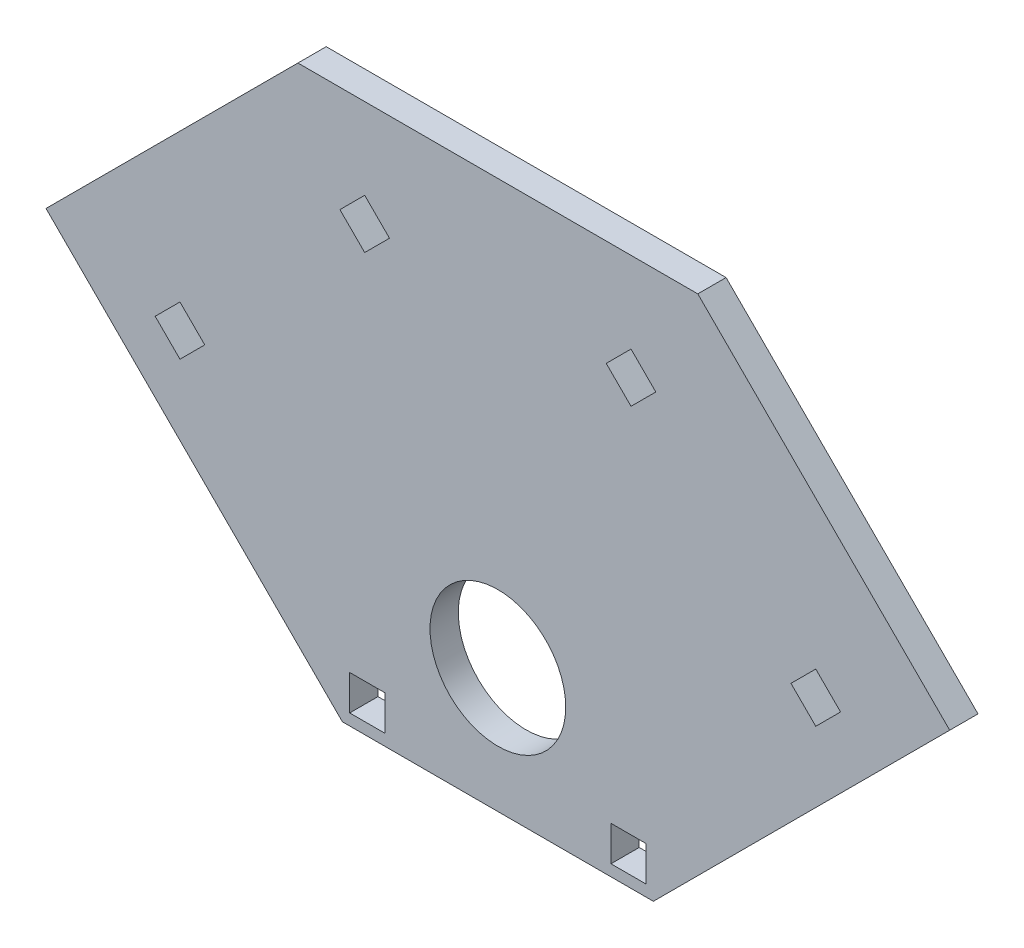
ISO-10303-21;
HEADER;
FILE_DESCRIPTION(('STEP AP214'),'2;1');
FILE_NAME('part.step','',(''),(''),'','','');
FILE_SCHEMA(('AUTOMOTIVE_DESIGN { 1 0 10303 214 1 1 1 1 }'));
ENDSEC;
DATA;
#1=APPLICATION_CONTEXT('core data for automotive mechanical design processes');
#2=APPLICATION_PROTOCOL_DEFINITION('international standard','automotive_design',2000,#1);
#3=PRODUCT_CONTEXT('',#1,'mechanical');
#4=PRODUCT('Part','Part','',(#3));
#5=PRODUCT_RELATED_PRODUCT_CATEGORY('part','',(#4));
#6=PRODUCT_DEFINITION_FORMATION('','',#4);
#7=PRODUCT_DEFINITION_CONTEXT('part definition',#1,'design');
#8=PRODUCT_DEFINITION('design','',#6,#7);
#9=PRODUCT_DEFINITION_SHAPE('','',#8);
#10=(LENGTH_UNIT() NAMED_UNIT(*) SI_UNIT(.MILLI.,.METRE.));
#11=(NAMED_UNIT(*) PLANE_ANGLE_UNIT() SI_UNIT($,.RADIAN.));
#12=(NAMED_UNIT(*) SI_UNIT($,.STERADIAN.) SOLID_ANGLE_UNIT());
#13=UNCERTAINTY_MEASURE_WITH_UNIT(LENGTH_MEASURE(1.E-05),#10,'distance_accuracy_value','');
#14=(GEOMETRIC_REPRESENTATION_CONTEXT(3) GLOBAL_UNCERTAINTY_ASSIGNED_CONTEXT((#13)) GLOBAL_UNIT_ASSIGNED_CONTEXT((#10,
#11,#12)) REPRESENTATION_CONTEXT('',''));
#15=CARTESIAN_POINT('',(0.,0.,0.));
#16=DIRECTION('',(0.,0.,1.));
#17=DIRECTION('',(1.,0.,0.));
#18=AXIS2_PLACEMENT_3D('',#15,#16,#17);
#19=CARTESIAN_POINT('',(0.,0.,5.));
#20=DIRECTION('',(0.,0.,-1.));
#21=DIRECTION('',(-1.,0.,0.));
#22=AXIS2_PLACEMENT_3D('',#19,#20,#21);
#23=PLANE('',#22);
#24=DIRECTION('',(-0.707106781186548,-0.707106781186547,0.));
#25=VECTOR('',#24,1.);
#26=CARTESIAN_POINT('',(56.2149891043305,27.9307178568685,5.));
#27=LINE('',#26,#25);
#28=CARTESIAN_POINT('',(56.2149891043305,27.9307178568685,5.));
#29=VERTEX_POINT('',#28);
#30=CARTESIAN_POINT('',(51.830927060974,23.546655813512,5.));
#31=VERTEX_POINT('',#30);
#32=EDGE_CURVE('E274',#29,#31,#27,.T.);
#33=ORIENTED_EDGE('',*,*,#32,.F.);
#34=DIRECTION('',(-0.707106781186546,0.707106781186549,0.));
#35=VECTOR('',#34,1.);
#36=CARTESIAN_POINT('',(60.599051147687,23.546655813512,5.));
#37=LINE('',#36,#35);
#38=CARTESIAN_POINT('',(60.5990511476871,23.546655813512,5.));
#39=VERTEX_POINT('',#38);
#40=EDGE_CURVE('E282',#39,#29,#37,.T.);
#41=ORIENTED_EDGE('',*,*,#40,.F.);
#42=DIRECTION('',(0.707106781186536,0.707106781186559,0.));
#43=VECTOR('',#42,1.);
#44=CARTESIAN_POINT('',(56.2149891043306,19.1625937701554,5.));
#45=LINE('',#44,#43);
#46=CARTESIAN_POINT('',(56.2149891043306,19.1625937701554,5.));
#47=VERTEX_POINT('',#46);
#48=EDGE_CURVE('E279',#47,#39,#45,.T.);
#49=ORIENTED_EDGE('',*,*,#48,.F.);
#50=DIRECTION('',(0.707106781186548,-0.707106781186547,0.));
#51=VECTOR('',#50,1.);
#52=CARTESIAN_POINT('',(51.830927060974,23.546655813512,5.));
#53=LINE('',#52,#51);
#54=EDGE_CURVE('E276',#31,#47,#53,.T.);
#55=ORIENTED_EDGE('',*,*,#54,.F.);
#56=EDGE_LOOP('',(#33,#41,#49,#55));
#57=FACE_BOUND('',#56,.T.);
#58=DIRECTION('',(0.,1.,0.));
#59=VECTOR('',#58,1.);
#60=CARTESIAN_POINT('',(-20.,-20.,5.));
#61=LINE('',#60,#59);
#62=CARTESIAN_POINT('',(-20.,-20.,5.));
#63=VERTEX_POINT('',#62);
#64=CARTESIAN_POINT('',(-20.,-13.8,5.));
#65=VERTEX_POINT('',#64);
#66=EDGE_CURVE('E336',#63,#65,#61,.T.);
#67=ORIENTED_EDGE('',*,*,#66,.F.);
#68=DIRECTION('',(1.,0.,0.));
#69=VECTOR('',#68,1.);
#70=CARTESIAN_POINT('',(-26.2,-20.,5.));
#71=LINE('',#70,#69);
#72=CARTESIAN_POINT('',(-26.2,-20.,5.));
#73=VERTEX_POINT('',#72);
#74=EDGE_CURVE('E344',#73,#63,#71,.T.);
#75=ORIENTED_EDGE('',*,*,#74,.F.);
#76=DIRECTION('',(0.,-1.,0.));
#77=VECTOR('',#76,1.);
#78=CARTESIAN_POINT('',(-26.2,-20.,5.));
#79=LINE('',#78,#77);
#80=CARTESIAN_POINT('',(-26.2,-13.8,5.));
#81=VERTEX_POINT('',#80);
#82=EDGE_CURVE('E341',#81,#73,#79,.T.);
#83=ORIENTED_EDGE('',*,*,#82,.F.);
#84=DIRECTION('',(-1.,0.,0.));
#85=VECTOR('',#84,1.);
#86=CARTESIAN_POINT('',(-26.2,-13.8,5.));
#87=LINE('',#86,#85);
#88=EDGE_CURVE('E338',#65,#81,#87,.T.);
#89=ORIENTED_EDGE('',*,*,#88,.F.);
#90=EDGE_LOOP('',(#67,#75,#83,#89));
#91=FACE_BOUND('',#90,.T.);
#92=DIRECTION('',(0.707106781186536,-0.707106781186559,0.));
#93=VECTOR('',#92,1.);
#94=CARTESIAN_POINT('',(-56.2149891043306,19.1625937701554,5.));
#95=LINE('',#94,#93);
#96=CARTESIAN_POINT('',(-60.599051147687,23.546655813512,5.));
#97=VERTEX_POINT('',#96);
#98=CARTESIAN_POINT('',(-56.2149891043306,19.1625937701554,5.));
#99=VERTEX_POINT('',#98);
#100=EDGE_CURVE('E398',#97,#99,#95,.T.);
#101=ORIENTED_EDGE('',*,*,#100,.F.);
#102=DIRECTION('',(-0.707106781186546,-0.707106781186549,0.));
#103=VECTOR('',#102,1.);
#104=CARTESIAN_POINT('',(-60.599051147687,23.546655813512,5.));
#105=LINE('',#104,#103);
#106=CARTESIAN_POINT('',(-56.2149891043305,27.9307178568685,5.));
#107=VERTEX_POINT('',#106);
#108=EDGE_CURVE('E406',#107,#97,#105,.T.);
#109=ORIENTED_EDGE('',*,*,#108,.F.);
#110=DIRECTION('',(-0.707106781186548,0.707106781186547,0.));
#111=VECTOR('',#110,1.);
#112=CARTESIAN_POINT('',(-56.2149891043305,27.9307178568685,5.));
#113=LINE('',#112,#111);
#114=CARTESIAN_POINT('',(-51.830927060974,23.546655813512,5.));
#115=VERTEX_POINT('',#114);
#116=EDGE_CURVE('E403',#115,#107,#113,.T.);
#117=ORIENTED_EDGE('',*,*,#116,.F.);
#118=DIRECTION('',(0.707106781186548,0.707106781186547,0.));
#119=VECTOR('',#118,1.);
#120=CARTESIAN_POINT('',(-51.830927060974,23.546655813512,5.));
#121=LINE('',#120,#119);
#122=EDGE_CURVE('E400',#99,#115,#121,.T.);
#123=ORIENTED_EDGE('',*,*,#122,.F.);
#124=EDGE_LOOP('',(#101,#109,#117,#123));
#125=FACE_BOUND('',#124,.T.);
#126=DIRECTION('',(-0.707106781186545,-0.70710678118655,0.));
#127=VECTOR('',#126,1.);
#128=CARTESIAN_POINT('',(-41.0121933088199,69.2964645562816,5.));
#129=LINE('',#128,#127);
#130=CARTESIAN_POINT('',(-35.3553390593275,74.953318805774,5.));
#131=VERTEX_POINT('',#130);
#132=CARTESIAN_POINT('',(-79.9030662740799,30.4055915910214,5.));
#133=VERTEX_POINT('',#132);
#134=EDGE_CURVE('E435',#131,#133,#129,.T.);
#135=ORIENTED_EDGE('',*,*,#134,.T.);
#136=DIRECTION('',(0.707106781186549,-0.707106781186546,0.));
#137=VECTOR('',#136,1.);
#138=CARTESIAN_POINT('',(-27.4974746830583,-22.,5.));
#139=LINE('',#138,#137);
#140=CARTESIAN_POINT('',(-27.4974746830583,-22.,5.));
#141=VERTEX_POINT('',#140);
#142=EDGE_CURVE('E437',#133,#141,#139,.T.);
#143=ORIENTED_EDGE('',*,*,#142,.T.);
#144=DIRECTION('',(1.,0.,0.));
#145=VECTOR('',#144,1.);
#146=CARTESIAN_POINT('',(-27.4974746830583,-22.,5.));
#147=LINE('',#146,#145);
#148=CARTESIAN_POINT('',(27.4974746830583,-22.,5.));
#149=VERTEX_POINT('',#148);
#150=EDGE_CURVE('E440',#141,#149,#147,.T.);
#151=ORIENTED_EDGE('',*,*,#150,.T.);
#152=DIRECTION('',(0.707106781186549,0.707106781186546,0.));
#153=VECTOR('',#152,1.);
#154=CARTESIAN_POINT('',(27.4974746830583,-22.,5.));
#155=LINE('',#154,#153);
#156=CARTESIAN_POINT('',(79.9030662740799,30.4055915910214,5.));
#157=VERTEX_POINT('',#156);
#158=EDGE_CURVE('E442',#149,#157,#155,.T.);
#159=ORIENTED_EDGE('',*,*,#158,.T.);
#160=DIRECTION('',(-0.707106781186547,0.707106781186548,0.));
#161=VECTOR('',#160,1.);
#162=CARTESIAN_POINT('',(79.9030662740799,30.4055915910214,5.));
#163=LINE('',#162,#161);
#164=CARTESIAN_POINT('',(35.3553390593276,74.9533188057739,5.));
#165=VERTEX_POINT('',#164);
#166=EDGE_CURVE('E444',#157,#165,#163,.T.);
#167=ORIENTED_EDGE('',*,*,#166,.T.);
#168=DIRECTION('',(-1.,0.,0.));
#169=VECTOR('',#168,1.);
#170=CARTESIAN_POINT('',(-35.3553390593275,74.953318805774,5.));
#171=LINE('',#170,#169);
#172=EDGE_CURVE('E446',#165,#131,#171,.T.);
#173=ORIENTED_EDGE('',*,*,#172,.T.);
#174=EDGE_LOOP('',(#135,#143,#151,#159,#167,#173));
#175=FACE_BOUND('',#174,.T.);
#176=CARTESIAN_POINT('',(0.,0.,5.));
#177=DIRECTION('',(0.,0.,1.));
#178=DIRECTION('',(1.,0.,0.));
#179=AXIS2_PLACEMENT_3D('',#176,#177,#178);
#180=CIRCLE('',#179,12.);
#181=CARTESIAN_POINT('',(12.,0.,5.));
#182=VERTEX_POINT('',#181);
#183=EDGE_CURVE('E429',#182,#182,#180,.T.);
#184=ORIENTED_EDGE('',*,*,#183,.F.);
#185=EDGE_LOOP('',(#184));
#186=FACE_BOUND('',#185,.T.);
#187=DIRECTION('',(0.707106781186548,-0.707106781186547,0.));
#188=VECTOR('',#187,1.);
#189=CARTESIAN_POINT('',(-23.5466558135121,51.8309270609738,5.));
#190=LINE('',#189,#188);
#191=CARTESIAN_POINT('',(-27.9307178568687,56.2149891043304,5.));
#192=VERTEX_POINT('',#191);
#193=CARTESIAN_POINT('',(-23.5466558135121,51.8309270609738,5.));
#194=VERTEX_POINT('',#193);
#195=EDGE_CURVE('E367',#192,#194,#190,.T.);
#196=ORIENTED_EDGE('',*,*,#195,.F.);
#197=DIRECTION('',(-0.707106781186545,-0.70710678118655,0.));
#198=VECTOR('',#197,1.);
#199=CARTESIAN_POINT('',(-27.9307178568687,56.2149891043304,5.));
#200=LINE('',#199,#198);
#201=CARTESIAN_POINT('',(-23.5466558135121,60.599051147687,5.));
#202=VERTEX_POINT('',#201);
#203=EDGE_CURVE('E375',#202,#192,#200,.T.);
#204=ORIENTED_EDGE('',*,*,#203,.F.);
#205=DIRECTION('',(-0.707106781186549,0.707106781186546,0.));
#206=VECTOR('',#205,1.);
#207=CARTESIAN_POINT('',(-23.5466558135121,60.599051147687,5.));
#208=LINE('',#207,#206);
#209=CARTESIAN_POINT('',(-19.1625937701555,56.2149891043304,5.));
#210=VERTEX_POINT('',#209);
#211=EDGE_CURVE('E372',#210,#202,#208,.T.);
#212=ORIENTED_EDGE('',*,*,#211,.F.);
#213=DIRECTION('',(0.707106781186546,0.707106781186549,0.));
#214=VECTOR('',#213,1.);
#215=CARTESIAN_POINT('',(-19.1625937701555,56.2149891043304,5.));
#216=LINE('',#215,#214);
#217=EDGE_CURVE('E369',#194,#210,#216,.T.);
#218=ORIENTED_EDGE('',*,*,#217,.F.);
#219=EDGE_LOOP('',(#196,#204,#212,#218));
#220=FACE_BOUND('',#219,.T.);
#221=DIRECTION('',(-0.707106781186549,-0.707106781186546,0.));
#222=VECTOR('',#221,1.);
#223=CARTESIAN_POINT('',(23.5466558135121,60.599051147687,5.));
#224=LINE('',#223,#222);
#225=CARTESIAN_POINT('',(23.5466558135121,60.599051147687,5.));
#226=VERTEX_POINT('',#225);
#227=CARTESIAN_POINT('',(19.1625937701555,56.2149891043304,5.));
#228=VERTEX_POINT('',#227);
#229=EDGE_CURVE('E305',#226,#228,#224,.T.);
#230=ORIENTED_EDGE('',*,*,#229,.F.);
#231=DIRECTION('',(-0.707106781186545,0.70710678118655,0.));
#232=VECTOR('',#231,1.);
#233=CARTESIAN_POINT('',(27.9307178568687,56.2149891043304,5.));
#234=LINE('',#233,#232);
#235=CARTESIAN_POINT('',(27.9307178568687,56.2149891043304,5.));
#236=VERTEX_POINT('',#235);
#237=EDGE_CURVE('E313',#236,#226,#234,.T.);
#238=ORIENTED_EDGE('',*,*,#237,.F.);
#239=DIRECTION('',(0.707106781186549,0.707106781186546,0.));
#240=VECTOR('',#239,1.);
#241=CARTESIAN_POINT('',(23.5466558135121,51.8309270609738,5.));
#242=LINE('',#241,#240);
#243=CARTESIAN_POINT('',(23.5466558135121,51.8309270609738,5.));
#244=VERTEX_POINT('',#243);
#245=EDGE_CURVE('E310',#244,#236,#242,.T.);
#246=ORIENTED_EDGE('',*,*,#245,.F.);
#247=DIRECTION('',(0.707106781186546,-0.707106781186549,0.));
#248=VECTOR('',#247,1.);
#249=CARTESIAN_POINT('',(19.1625937701555,56.2149891043304,5.));
#250=LINE('',#249,#248);
#251=EDGE_CURVE('E307',#228,#244,#250,.T.);
#252=ORIENTED_EDGE('',*,*,#251,.F.);
#253=EDGE_LOOP('',(#230,#238,#246,#252));
#254=FACE_BOUND('',#253,.T.);
#255=DIRECTION('',(0.,1.,0.));
#256=VECTOR('',#255,1.);
#257=CARTESIAN_POINT('',(26.2,-20.,5.));
#258=LINE('',#257,#256);
#259=CARTESIAN_POINT('',(26.2,-20.,5.));
#260=VERTEX_POINT('',#259);
#261=CARTESIAN_POINT('',(26.2,-13.8,5.));
#262=VERTEX_POINT('',#261);
#263=EDGE_CURVE('E238',#260,#262,#258,.T.);
#264=ORIENTED_EDGE('',*,*,#263,.F.);
#265=DIRECTION('',(1.,0.,0.));
#266=VECTOR('',#265,1.);
#267=CARTESIAN_POINT('',(26.2,-20.,5.));
#268=LINE('',#267,#266);
#269=CARTESIAN_POINT('',(20.,-20.,5.));
#270=VERTEX_POINT('',#269);
#271=EDGE_CURVE('E260',#270,#260,#268,.T.);
#272=ORIENTED_EDGE('',*,*,#271,.F.);
#273=DIRECTION('',(0.,-1.,0.));
#274=VECTOR('',#273,1.);
#275=CARTESIAN_POINT('',(20.,-20.,5.));
#276=LINE('',#275,#274);
#277=CARTESIAN_POINT('',(20.,-13.8,5.));
#278=VERTEX_POINT('',#277);
#279=EDGE_CURVE('E258',#278,#270,#276,.T.);
#280=ORIENTED_EDGE('',*,*,#279,.F.);
#281=DIRECTION('',(-1.,0.,0.));
#282=VECTOR('',#281,1.);
#283=CARTESIAN_POINT('',(26.2,-13.8,5.));
#284=LINE('',#283,#282);
#285=EDGE_CURVE('E246',#262,#278,#284,.T.);
#286=ORIENTED_EDGE('',*,*,#285,.F.);
#287=EDGE_LOOP('',(#264,#272,#280,#286));
#288=FACE_BOUND('',#287,.T.);
#289=ADVANCED_FACE('F41',(#57,#91,#125,#175,#186,#220,#254,#288),#23,.F.);
#290=CARTESIAN_POINT('',(0.,0.,0.));
#291=DIRECTION('',(0.,0.,-1.));
#292=DIRECTION('',(-1.,0.,0.));
#293=AXIS2_PLACEMENT_3D('',#290,#291,#292);
#294=PLANE('',#293);
#295=DIRECTION('',(-0.707106781186548,-0.707106781186547,0.));
#296=VECTOR('',#295,1.);
#297=CARTESIAN_POINT('',(-79.9030662740799,30.4055915910214,0.));
#298=LINE('',#297,#296);
#299=CARTESIAN_POINT('',(-35.3553390593275,74.953318805774,0.));
#300=VERTEX_POINT('',#299);
#301=CARTESIAN_POINT('',(-79.9030662740799,30.4055915910214,0.));
#302=VERTEX_POINT('',#301);
#303=EDGE_CURVE('E432',#300,#302,#298,.T.);
#304=ORIENTED_EDGE('',*,*,#303,.F.);
#305=DIRECTION('',(-1.,0.,0.));
#306=VECTOR('',#305,1.);
#307=CARTESIAN_POINT('',(-35.3553390593275,74.953318805774,0.));
#308=LINE('',#307,#306);
#309=CARTESIAN_POINT('',(35.3553390593276,74.9533188057739,0.));
#310=VERTEX_POINT('',#309);
#311=EDGE_CURVE('E438',#310,#300,#308,.T.);
#312=ORIENTED_EDGE('',*,*,#311,.F.);
#313=DIRECTION('',(-0.707106781186546,0.707106781186549,0.));
#314=VECTOR('',#313,1.);
#315=CARTESIAN_POINT('',(35.3553390593276,74.9533188057739,0.));
#316=LINE('',#315,#314);
#317=CARTESIAN_POINT('',(79.9030662740799,30.4055915910214,0.));
#318=VERTEX_POINT('',#317);
#319=EDGE_CURVE('E457',#318,#310,#316,.T.);
#320=ORIENTED_EDGE('',*,*,#319,.F.);
#321=DIRECTION('',(0.707106781186549,0.707106781186546,0.));
#322=VECTOR('',#321,1.);
#323=CARTESIAN_POINT('',(27.4974746830583,-22.,0.));
#324=LINE('',#323,#322);
#325=CARTESIAN_POINT('',(27.4974746830583,-22.,0.));
#326=VERTEX_POINT('',#325);
#327=EDGE_CURVE('E454',#326,#318,#324,.T.);
#328=ORIENTED_EDGE('',*,*,#327,.F.);
#329=DIRECTION('',(1.,0.,0.));
#330=VECTOR('',#329,1.);
#331=CARTESIAN_POINT('',(-27.4974746830583,-22.,0.));
#332=LINE('',#331,#330);
#333=CARTESIAN_POINT('',(-27.4974746830583,-22.,0.));
#334=VERTEX_POINT('',#333);
#335=EDGE_CURVE('E452',#334,#326,#332,.T.);
#336=ORIENTED_EDGE('',*,*,#335,.F.);
#337=DIRECTION('',(0.707106781186549,-0.707106781186546,0.));
#338=VECTOR('',#337,1.);
#339=CARTESIAN_POINT('',(-27.4974746830583,-22.,0.));
#340=LINE('',#339,#338);
#341=EDGE_CURVE('E450',#302,#334,#340,.T.);
#342=ORIENTED_EDGE('',*,*,#341,.F.);
#343=EDGE_LOOP('',(#304,#312,#320,#328,#336,#342));
#344=FACE_BOUND('',#343,.T.);
#345=CARTESIAN_POINT('',(0.,0.,0.));
#346=DIRECTION('',(0.,0.,1.));
#347=DIRECTION('',(1.,0.,0.));
#348=AXIS2_PLACEMENT_3D('',#345,#346,#347);
#349=CIRCLE('',#348,12.);
#350=CARTESIAN_POINT('',(12.,0.,0.));
#351=VERTEX_POINT('',#350);
#352=EDGE_CURVE('E428',#351,#351,#349,.T.);
#353=ORIENTED_EDGE('',*,*,#352,.T.);
#354=EDGE_LOOP('',(#353));
#355=FACE_BOUND('',#354,.T.);
#356=DIRECTION('',(-0.707106781186546,-0.707106781186549,0.));
#357=VECTOR('',#356,1.);
#358=CARTESIAN_POINT('',(-60.599051147687,23.546655813512,0.));
#359=LINE('',#358,#357);
#360=CARTESIAN_POINT('',(-56.2149891043305,27.9307178568685,0.));
#361=VERTEX_POINT('',#360);
#362=CARTESIAN_POINT('',(-60.5990511476871,23.546655813512,0.));
#363=VERTEX_POINT('',#362);
#364=EDGE_CURVE('E401',#361,#363,#359,.T.);
#365=ORIENTED_EDGE('',*,*,#364,.T.);
#366=DIRECTION('',(0.707106781186536,-0.707106781186559,0.));
#367=VECTOR('',#366,1.);
#368=CARTESIAN_POINT('',(-56.2149891043306,19.1625937701554,0.));
#369=LINE('',#368,#367);
#370=CARTESIAN_POINT('',(-56.2149891043306,19.1625937701554,0.));
#371=VERTEX_POINT('',#370);
#372=EDGE_CURVE('E397',#363,#371,#369,.T.);
#373=ORIENTED_EDGE('',*,*,#372,.T.);
#374=DIRECTION('',(0.707106781186548,0.707106781186547,0.));
#375=VECTOR('',#374,1.);
#376=CARTESIAN_POINT('',(-51.830927060974,23.546655813512,0.));
#377=LINE('',#376,#375);
#378=CARTESIAN_POINT('',(-51.830927060974,23.546655813512,0.));
#379=VERTEX_POINT('',#378);
#380=EDGE_CURVE('E411',#371,#379,#377,.T.);
#381=ORIENTED_EDGE('',*,*,#380,.T.);
#382=DIRECTION('',(-0.707106781186548,0.707106781186547,0.));
#383=VECTOR('',#382,1.);
#384=CARTESIAN_POINT('',(-56.2149891043305,27.9307178568685,0.));
#385=LINE('',#384,#383);
#386=EDGE_CURVE('E414',#379,#361,#385,.T.);
#387=ORIENTED_EDGE('',*,*,#386,.T.);
#388=EDGE_LOOP('',(#365,#373,#381,#387));
#389=FACE_BOUND('',#388,.T.);
#390=DIRECTION('',(-0.707106781186545,-0.70710678118655,0.));
#391=VECTOR('',#390,1.);
#392=CARTESIAN_POINT('',(-27.9307178568687,56.2149891043304,0.));
#393=LINE('',#392,#391);
#394=CARTESIAN_POINT('',(-23.5466558135121,60.599051147687,0.));
#395=VERTEX_POINT('',#394);
#396=CARTESIAN_POINT('',(-27.9307178568687,56.2149891043304,0.));
#397=VERTEX_POINT('',#396);
#398=EDGE_CURVE('E370',#395,#397,#393,.T.);
#399=ORIENTED_EDGE('',*,*,#398,.T.);
#400=DIRECTION('',(0.707106781186548,-0.707106781186547,0.));
#401=VECTOR('',#400,1.);
#402=CARTESIAN_POINT('',(-23.5466558135121,51.8309270609738,0.));
#403=LINE('',#402,#401);
#404=CARTESIAN_POINT('',(-23.5466558135121,51.8309270609738,0.));
#405=VERTEX_POINT('',#404);
#406=EDGE_CURVE('E366',#397,#405,#403,.T.);
#407=ORIENTED_EDGE('',*,*,#406,.T.);
#408=DIRECTION('',(0.707106781186546,0.707106781186549,0.));
#409=VECTOR('',#408,1.);
#410=CARTESIAN_POINT('',(-19.1625937701555,56.2149891043304,0.));
#411=LINE('',#410,#409);
#412=CARTESIAN_POINT('',(-19.1625937701555,56.2149891043304,0.));
#413=VERTEX_POINT('',#412);
#414=EDGE_CURVE('E380',#405,#413,#411,.T.);
#415=ORIENTED_EDGE('',*,*,#414,.T.);
#416=DIRECTION('',(-0.707106781186549,0.707106781186546,0.));
#417=VECTOR('',#416,1.);
#418=CARTESIAN_POINT('',(-23.5466558135121,60.599051147687,0.));
#419=LINE('',#418,#417);
#420=EDGE_CURVE('E383',#413,#395,#419,.T.);
#421=ORIENTED_EDGE('',*,*,#420,.T.);
#422=EDGE_LOOP('',(#399,#407,#415,#421));
#423=FACE_BOUND('',#422,.T.);
#424=DIRECTION('',(1.,0.,0.));
#425=VECTOR('',#424,1.);
#426=CARTESIAN_POINT('',(-26.2,-20.,0.));
#427=LINE('',#426,#425);
#428=CARTESIAN_POINT('',(-26.2,-20.,0.));
#429=VERTEX_POINT('',#428);
#430=CARTESIAN_POINT('',(-20.,-20.,0.));
#431=VERTEX_POINT('',#430);
#432=EDGE_CURVE('E339',#429,#431,#427,.T.);
#433=ORIENTED_EDGE('',*,*,#432,.T.);
#434=DIRECTION('',(0.,1.,0.));
#435=VECTOR('',#434,1.);
#436=CARTESIAN_POINT('',(-20.,-20.,0.));
#437=LINE('',#436,#435);
#438=CARTESIAN_POINT('',(-20.,-13.8,0.));
#439=VERTEX_POINT('',#438);
#440=EDGE_CURVE('E335',#431,#439,#437,.T.);
#441=ORIENTED_EDGE('',*,*,#440,.T.);
#442=DIRECTION('',(-1.,0.,0.));
#443=VECTOR('',#442,1.);
#444=CARTESIAN_POINT('',(-26.2,-13.8,0.));
#445=LINE('',#444,#443);
#446=CARTESIAN_POINT('',(-26.2,-13.8,0.));
#447=VERTEX_POINT('',#446);
#448=EDGE_CURVE('E349',#439,#447,#445,.T.);
#449=ORIENTED_EDGE('',*,*,#448,.T.);
#450=DIRECTION('',(0.,-1.,0.));
#451=VECTOR('',#450,1.);
#452=CARTESIAN_POINT('',(-26.2,-20.,0.));
#453=LINE('',#452,#451);
#454=EDGE_CURVE('E352',#447,#429,#453,.T.);
#455=ORIENTED_EDGE('',*,*,#454,.T.);
#456=EDGE_LOOP('',(#433,#441,#449,#455));
#457=FACE_BOUND('',#456,.T.);
#458=DIRECTION('',(-0.707106781186545,0.70710678118655,0.));
#459=VECTOR('',#458,1.);
#460=CARTESIAN_POINT('',(27.9307178568687,56.2149891043304,0.));
#461=LINE('',#460,#459);
#462=CARTESIAN_POINT('',(27.9307178568687,56.2149891043304,0.));
#463=VERTEX_POINT('',#462);
#464=CARTESIAN_POINT('',(23.5466558135121,60.599051147687,0.));
#465=VERTEX_POINT('',#464);
#466=EDGE_CURVE('E308',#463,#465,#461,.T.);
#467=ORIENTED_EDGE('',*,*,#466,.T.);
#468=DIRECTION('',(-0.707106781186549,-0.707106781186546,0.));
#469=VECTOR('',#468,1.);
#470=CARTESIAN_POINT('',(23.5466558135121,60.599051147687,0.));
#471=LINE('',#470,#469);
#472=CARTESIAN_POINT('',(19.1625937701555,56.2149891043304,0.));
#473=VERTEX_POINT('',#472);
#474=EDGE_CURVE('E304',#465,#473,#471,.T.);
#475=ORIENTED_EDGE('',*,*,#474,.T.);
#476=DIRECTION('',(0.707106781186546,-0.707106781186549,0.));
#477=VECTOR('',#476,1.);
#478=CARTESIAN_POINT('',(19.1625937701555,56.2149891043304,0.));
#479=LINE('',#478,#477);
#480=CARTESIAN_POINT('',(23.5466558135121,51.8309270609738,0.));
#481=VERTEX_POINT('',#480);
#482=EDGE_CURVE('E318',#473,#481,#479,.T.);
#483=ORIENTED_EDGE('',*,*,#482,.T.);
#484=DIRECTION('',(0.707106781186549,0.707106781186546,0.));
#485=VECTOR('',#484,1.);
#486=CARTESIAN_POINT('',(23.5466558135121,51.8309270609738,0.));
#487=LINE('',#486,#485);
#488=EDGE_CURVE('E321',#481,#463,#487,.T.);
#489=ORIENTED_EDGE('',*,*,#488,.T.);
#490=EDGE_LOOP('',(#467,#475,#483,#489));
#491=FACE_BOUND('',#490,.T.);
#492=DIRECTION('',(-0.707106781186546,0.707106781186549,0.));
#493=VECTOR('',#492,1.);
#494=CARTESIAN_POINT('',(60.599051147687,23.546655813512,0.));
#495=LINE('',#494,#493);
#496=CARTESIAN_POINT('',(60.599051147687,23.546655813512,0.));
#497=VERTEX_POINT('',#496);
#498=CARTESIAN_POINT('',(56.2149891043305,27.9307178568685,0.));
#499=VERTEX_POINT('',#498);
#500=EDGE_CURVE('E277',#497,#499,#495,.T.);
#501=ORIENTED_EDGE('',*,*,#500,.T.);
#502=DIRECTION('',(-0.707106781186548,-0.707106781186547,0.));
#503=VECTOR('',#502,1.);
#504=CARTESIAN_POINT('',(56.2149891043305,27.9307178568685,0.));
#505=LINE('',#504,#503);
#506=CARTESIAN_POINT('',(51.830927060974,23.546655813512,0.));
#507=VERTEX_POINT('',#506);
#508=EDGE_CURVE('E254',#499,#507,#505,.T.);
#509=ORIENTED_EDGE('',*,*,#508,.T.);
#510=DIRECTION('',(0.707106781186548,-0.707106781186547,0.));
#511=VECTOR('',#510,1.);
#512=CARTESIAN_POINT('',(51.830927060974,23.546655813512,0.));
#513=LINE('',#512,#511);
#514=CARTESIAN_POINT('',(56.2149891043306,19.1625937701554,0.));
#515=VERTEX_POINT('',#514);
#516=EDGE_CURVE('E287',#507,#515,#513,.T.);
#517=ORIENTED_EDGE('',*,*,#516,.T.);
#518=DIRECTION('',(0.707106781186536,0.707106781186559,0.));
#519=VECTOR('',#518,1.);
#520=CARTESIAN_POINT('',(56.2149891043306,19.1625937701554,0.));
#521=LINE('',#520,#519);
#522=EDGE_CURVE('E290',#515,#497,#521,.T.);
#523=ORIENTED_EDGE('',*,*,#522,.T.);
#524=EDGE_LOOP('',(#501,#509,#517,#523));
#525=FACE_BOUND('',#524,.T.);
#526=DIRECTION('',(1.,0.,0.));
#527=VECTOR('',#526,1.);
#528=CARTESIAN_POINT('',(26.2,-20.,0.));
#529=LINE('',#528,#527);
#530=CARTESIAN_POINT('',(20.,-20.,0.));
#531=VERTEX_POINT('',#530);
#532=CARTESIAN_POINT('',(26.2,-20.,0.));
#533=VERTEX_POINT('',#532);
#534=EDGE_CURVE('E247',#531,#533,#529,.T.);
#535=ORIENTED_EDGE('',*,*,#534,.T.);
#536=DIRECTION('',(0.,1.,0.));
#537=VECTOR('',#536,1.);
#538=CARTESIAN_POINT('',(26.2,-20.,0.));
#539=LINE('',#538,#537);
#540=CARTESIAN_POINT('',(26.2,-13.8,0.));
#541=VERTEX_POINT('',#540);
#542=EDGE_CURVE('E64',#533,#541,#539,.T.);
#543=ORIENTED_EDGE('',*,*,#542,.T.);
#544=DIRECTION('',(-1.,0.,0.));
#545=VECTOR('',#544,1.);
#546=CARTESIAN_POINT('',(26.2,-13.8,0.));
#547=LINE('',#546,#545);
#548=CARTESIAN_POINT('',(20.,-13.8,0.));
#549=VERTEX_POINT('',#548);
#550=EDGE_CURVE('E253',#541,#549,#547,.T.);
#551=ORIENTED_EDGE('',*,*,#550,.T.);
#552=DIRECTION('',(0.,-1.,0.));
#553=VECTOR('',#552,1.);
#554=CARTESIAN_POINT('',(20.,-20.,0.));
#555=LINE('',#554,#553);
#556=EDGE_CURVE('E266',#549,#531,#555,.T.);
#557=ORIENTED_EDGE('',*,*,#556,.T.);
#558=EDGE_LOOP('',(#535,#543,#551,#557));
#559=FACE_BOUND('',#558,.T.);
#560=ADVANCED_FACE('F483',(#344,#355,#389,#423,#457,#491,#525,#559),#294,.T.);
#561=CARTESIAN_POINT('',(-79.9030662740799,30.4055915910214,5.));
#562=DIRECTION('',(0.707106781186547,-0.707106781186548,0.));
#563=DIRECTION('',(0.707106781186548,0.707106781186547,0.));
#564=AXIS2_PLACEMENT_3D('',#561,#562,#563);
#565=PLANE('',#564);
#566=ORIENTED_EDGE('',*,*,#303,.T.);
#567=DIRECTION('',(0.,0.,-1.));
#568=VECTOR('',#567,1.);
#569=CARTESIAN_POINT('',(-79.9030662740799,30.4055915910214,5.));
#570=LINE('',#569,#568);
#571=EDGE_CURVE('E11',#133,#302,#570,.T.);
#572=ORIENTED_EDGE('',*,*,#571,.F.);
#573=ORIENTED_EDGE('',*,*,#134,.F.);
#574=DIRECTION('',(0.,0.,-1.));
#575=VECTOR('',#574,1.);
#576=CARTESIAN_POINT('',(-35.3553390593275,74.953318805774,5.));
#577=LINE('',#576,#575);
#578=EDGE_CURVE('E448',#131,#300,#577,.T.);
#579=ORIENTED_EDGE('',*,*,#578,.T.);
#580=EDGE_LOOP('',(#566,#572,#573,#579));
#581=FACE_BOUND('',#580,.T.);
#582=ADVANCED_FACE('F43',(#581),#565,.F.);
#583=CARTESIAN_POINT('',(-27.4974746830583,-22.,5.));
#584=DIRECTION('',(0.707106781186546,0.707106781186549,0.));
#585=DIRECTION('',(-0.707106781186549,0.707106781186546,0.));
#586=AXIS2_PLACEMENT_3D('',#583,#584,#585);
#587=PLANE('',#586);
#588=ORIENTED_EDGE('',*,*,#341,.T.);
#589=DIRECTION('',(0.,0.,-1.));
#590=VECTOR('',#589,1.);
#591=CARTESIAN_POINT('',(-27.4974746830583,-22.,5.));
#592=LINE('',#591,#590);
#593=EDGE_CURVE('E49',#141,#334,#592,.T.);
#594=ORIENTED_EDGE('',*,*,#593,.F.);
#595=ORIENTED_EDGE('',*,*,#142,.F.);
#596=ORIENTED_EDGE('',*,*,#571,.T.);
#597=EDGE_LOOP('',(#588,#594,#595,#596));
#598=FACE_BOUND('',#597,.T.);
#599=ADVANCED_FACE('F500',(#598),#587,.F.);
#600=CARTESIAN_POINT('',(-27.4974746830583,-22.,5.));
#601=DIRECTION('',(0.,1.,0.));
#602=DIRECTION('',(-1.,0.,0.));
#603=AXIS2_PLACEMENT_3D('',#600,#601,#602);
#604=PLANE('',#603);
#605=ORIENTED_EDGE('',*,*,#335,.T.);
#606=DIRECTION('',(0.,0.,-1.));
#607=VECTOR('',#606,1.);
#608=CARTESIAN_POINT('',(27.4974746830583,-22.,5.));
#609=LINE('',#608,#607);
#610=EDGE_CURVE('E469',#149,#326,#609,.T.);
#611=ORIENTED_EDGE('',*,*,#610,.F.);
#612=ORIENTED_EDGE('',*,*,#150,.F.);
#613=ORIENTED_EDGE('',*,*,#593,.T.);
#614=EDGE_LOOP('',(#605,#611,#612,#613));
#615=FACE_BOUND('',#614,.T.);
#616=ADVANCED_FACE('F476',(#615),#604,.F.);
#617=CARTESIAN_POINT('',(27.4974746830583,-22.,5.));
#618=DIRECTION('',(-0.707106781186546,0.707106781186549,0.));
#619=DIRECTION('',(-0.707106781186549,-0.707106781186546,0.));
#620=AXIS2_PLACEMENT_3D('',#617,#618,#619);
#621=PLANE('',#620);
#622=ORIENTED_EDGE('',*,*,#327,.T.);
#623=DIRECTION('',(0.,0.,-1.));
#624=VECTOR('',#623,1.);
#625=CARTESIAN_POINT('',(79.9030662740799,30.4055915910214,5.));
#626=LINE('',#625,#624);
#627=EDGE_CURVE('E466',#157,#318,#626,.T.);
#628=ORIENTED_EDGE('',*,*,#627,.F.);
#629=ORIENTED_EDGE('',*,*,#158,.F.);
#630=ORIENTED_EDGE('',*,*,#610,.T.);
#631=EDGE_LOOP('',(#622,#628,#629,#630));
#632=FACE_BOUND('',#631,.T.);
#633=ADVANCED_FACE('F488',(#632),#621,.F.);
#634=CARTESIAN_POINT('',(35.3553390593276,74.9533188057739,5.));
#635=DIRECTION('',(-0.707106781186549,-0.707106781186546,0.));
#636=DIRECTION('',(0.707106781186546,-0.707106781186549,0.));
#637=AXIS2_PLACEMENT_3D('',#634,#635,#636);
#638=PLANE('',#637);
#639=ORIENTED_EDGE('',*,*,#319,.T.);
#640=DIRECTION('',(0.,0.,-1.));
#641=VECTOR('',#640,1.);
#642=CARTESIAN_POINT('',(35.3553390593276,74.9533188057739,5.));
#643=LINE('',#642,#641);
#644=EDGE_CURVE('E463',#165,#310,#643,.T.);
#645=ORIENTED_EDGE('',*,*,#644,.F.);
#646=ORIENTED_EDGE('',*,*,#166,.F.);
#647=ORIENTED_EDGE('',*,*,#627,.T.);
#648=EDGE_LOOP('',(#639,#645,#646,#647));
#649=FACE_BOUND('',#648,.T.);
#650=ADVANCED_FACE('F492',(#649),#638,.F.);
#651=CARTESIAN_POINT('',(-35.3553390593275,74.953318805774,5.));
#652=DIRECTION('',(0.,-1.,0.));
#653=DIRECTION('',(1.,0.,0.));
#654=AXIS2_PLACEMENT_3D('',#651,#652,#653);
#655=PLANE('',#654);
#656=ORIENTED_EDGE('',*,*,#311,.T.);
#657=ORIENTED_EDGE('',*,*,#578,.F.);
#658=ORIENTED_EDGE('',*,*,#172,.F.);
#659=ORIENTED_EDGE('',*,*,#644,.T.);
#660=EDGE_LOOP('',(#656,#657,#658,#659));
#661=FACE_BOUND('',#660,.T.);
#662=ADVANCED_FACE('F503',(#661),#655,.F.);
#663=CARTESIAN_POINT('',(0.,0.,5.));
#664=DIRECTION('',(0.,0.,-1.));
#665=DIRECTION('',(-1.,0.,0.));
#666=AXIS2_PLACEMENT_3D('',#663,#664,#665);
#667=CYLINDRICAL_SURFACE('',#666,12.);
#668=ORIENTED_EDGE('',*,*,#183,.T.);
#669=EDGE_LOOP('',(#668));
#670=FACE_BOUND('',#669,.T.);
#671=ORIENTED_EDGE('',*,*,#352,.F.);
#672=EDGE_LOOP('',(#671));
#673=FACE_BOUND('',#672,.T.);
#674=ADVANCED_FACE('F505',(#670,#673),#667,.F.);
#675=CARTESIAN_POINT('',(-56.2149891043306,19.1625937701554,5.));
#676=DIRECTION('',(0.707106781186559,0.707106781186536,0.));
#677=DIRECTION('',(-0.707106781186536,0.707106781186559,0.));
#678=AXIS2_PLACEMENT_3D('',#675,#676,#677);
#679=PLANE('',#678);
#680=ORIENTED_EDGE('',*,*,#372,.F.);
#681=DIRECTION('',(0.,0.,-1.));
#682=VECTOR('',#681,1.);
#683=CARTESIAN_POINT('',(-60.599051147687,23.546655813512,5.));
#684=LINE('',#683,#682);
#685=EDGE_CURVE('E408',#97,#363,#684,.T.);
#686=ORIENTED_EDGE('',*,*,#685,.F.);
#687=ORIENTED_EDGE('',*,*,#100,.T.);
#688=DIRECTION('',(0.,0.,-1.));
#689=VECTOR('',#688,1.);
#690=CARTESIAN_POINT('',(-56.2149891043306,19.1625937701554,5.));
#691=LINE('',#690,#689);
#692=EDGE_CURVE('E425',#99,#371,#691,.T.);
#693=ORIENTED_EDGE('',*,*,#692,.T.);
#694=EDGE_LOOP('',(#680,#686,#687,#693));
#695=FACE_BOUND('',#694,.T.);
#696=ADVANCED_FACE('F511',(#695),#679,.T.);
#697=CARTESIAN_POINT('',(-51.830927060974,23.546655813512,5.));
#698=DIRECTION('',(-0.707106781186547,0.707106781186548,0.));
#699=DIRECTION('',(-0.707106781186548,-0.707106781186547,0.));
#700=AXIS2_PLACEMENT_3D('',#697,#698,#699);
#701=PLANE('',#700);
#702=ORIENTED_EDGE('',*,*,#380,.F.);
#703=ORIENTED_EDGE('',*,*,#692,.F.);
#704=ORIENTED_EDGE('',*,*,#122,.T.);
#705=DIRECTION('',(0.,0.,-1.));
#706=VECTOR('',#705,1.);
#707=CARTESIAN_POINT('',(-51.830927060974,23.546655813512,5.));
#708=LINE('',#707,#706);
#709=EDGE_CURVE('E423',#115,#379,#708,.T.);
#710=ORIENTED_EDGE('',*,*,#709,.T.);
#711=EDGE_LOOP('',(#702,#703,#704,#710));
#712=FACE_BOUND('',#711,.T.);
#713=ADVANCED_FACE('F527',(#712),#701,.T.);
#714=CARTESIAN_POINT('',(-56.2149891043305,27.9307178568685,5.));
#715=DIRECTION('',(-0.707106781186547,-0.707106781186548,0.));
#716=DIRECTION('',(0.707106781186548,-0.707106781186547,0.));
#717=AXIS2_PLACEMENT_3D('',#714,#715,#716);
#718=PLANE('',#717);
#719=ORIENTED_EDGE('',*,*,#386,.F.);
#720=ORIENTED_EDGE('',*,*,#709,.F.);
#721=ORIENTED_EDGE('',*,*,#116,.T.);
#722=DIRECTION('',(0.,0.,-1.));
#723=VECTOR('',#722,1.);
#724=CARTESIAN_POINT('',(-56.2149891043305,27.9307178568685,5.));
#725=LINE('',#724,#723);
#726=EDGE_CURVE('E421',#107,#361,#725,.T.);
#727=ORIENTED_EDGE('',*,*,#726,.T.);
#728=EDGE_LOOP('',(#719,#720,#721,#727));
#729=FACE_BOUND('',#728,.T.);
#730=ADVANCED_FACE('F531',(#729),#718,.T.);
#731=CARTESIAN_POINT('',(-60.599051147687,23.546655813512,5.));
#732=DIRECTION('',(0.707106781186549,-0.707106781186546,0.));
#733=DIRECTION('',(0.707106781186546,0.707106781186549,0.));
#734=AXIS2_PLACEMENT_3D('',#731,#732,#733);
#735=PLANE('',#734);
#736=ORIENTED_EDGE('',*,*,#364,.F.);
#737=ORIENTED_EDGE('',*,*,#726,.F.);
#738=ORIENTED_EDGE('',*,*,#108,.T.);
#739=ORIENTED_EDGE('',*,*,#685,.T.);
#740=EDGE_LOOP('',(#736,#737,#738,#739));
#741=FACE_BOUND('',#740,.T.);
#742=ADVANCED_FACE('F535',(#741),#735,.T.);
#743=CARTESIAN_POINT('',(-23.5466558135121,51.8309270609738,5.));
#744=DIRECTION('',(0.707106781186547,0.707106781186548,0.));
#745=DIRECTION('',(-0.707106781186548,0.707106781186547,0.));
#746=AXIS2_PLACEMENT_3D('',#743,#744,#745);
#747=PLANE('',#746);
#748=ORIENTED_EDGE('',*,*,#406,.F.);
#749=DIRECTION('',(0.,0.,-1.));
#750=VECTOR('',#749,1.);
#751=CARTESIAN_POINT('',(-27.9307178568687,56.2149891043304,5.));
#752=LINE('',#751,#750);
#753=EDGE_CURVE('E377',#192,#397,#752,.T.);
#754=ORIENTED_EDGE('',*,*,#753,.F.);
#755=ORIENTED_EDGE('',*,*,#195,.T.);
#756=DIRECTION('',(0.,0.,-1.));
#757=VECTOR('',#756,1.);
#758=CARTESIAN_POINT('',(-23.5466558135121,51.8309270609738,5.));
#759=LINE('',#758,#757);
#760=EDGE_CURVE('E394',#194,#405,#759,.T.);
#761=ORIENTED_EDGE('',*,*,#760,.T.);
#762=EDGE_LOOP('',(#748,#754,#755,#761));
#763=FACE_BOUND('',#762,.T.);
#764=ADVANCED_FACE('F539',(#763),#747,.T.);
#765=CARTESIAN_POINT('',(-19.1625937701555,56.2149891043304,5.));
#766=DIRECTION('',(-0.707106781186549,0.707106781186546,0.));
#767=DIRECTION('',(-0.707106781186546,-0.707106781186549,0.));
#768=AXIS2_PLACEMENT_3D('',#765,#766,#767);
#769=PLANE('',#768);
#770=ORIENTED_EDGE('',*,*,#414,.F.);
#771=ORIENTED_EDGE('',*,*,#760,.F.);
#772=ORIENTED_EDGE('',*,*,#217,.T.);
#773=DIRECTION('',(0.,0.,-1.));
#774=VECTOR('',#773,1.);
#775=CARTESIAN_POINT('',(-19.1625937701555,56.2149891043304,5.));
#776=LINE('',#775,#774);
#777=EDGE_CURVE('E392',#210,#413,#776,.T.);
#778=ORIENTED_EDGE('',*,*,#777,.T.);
#779=EDGE_LOOP('',(#770,#771,#772,#778));
#780=FACE_BOUND('',#779,.T.);
#781=ADVANCED_FACE('F543',(#780),#769,.T.);
#782=CARTESIAN_POINT('',(-23.5466558135121,60.599051147687,5.));
#783=DIRECTION('',(-0.707106781186546,-0.707106781186549,0.));
#784=DIRECTION('',(0.707106781186549,-0.707106781186546,0.));
#785=AXIS2_PLACEMENT_3D('',#782,#783,#784);
#786=PLANE('',#785);
#787=ORIENTED_EDGE('',*,*,#420,.F.);
#788=ORIENTED_EDGE('',*,*,#777,.F.);
#789=ORIENTED_EDGE('',*,*,#211,.T.);
#790=DIRECTION('',(0.,0.,-1.));
#791=VECTOR('',#790,1.);
#792=CARTESIAN_POINT('',(-23.5466558135121,60.599051147687,5.));
#793=LINE('',#792,#791);
#794=EDGE_CURVE('E390',#202,#395,#793,.T.);
#795=ORIENTED_EDGE('',*,*,#794,.T.);
#796=EDGE_LOOP('',(#787,#788,#789,#795));
#797=FACE_BOUND('',#796,.T.);
#798=ADVANCED_FACE('F547',(#797),#786,.T.);
#799=CARTESIAN_POINT('',(-27.9307178568687,56.2149891043304,5.));
#800=DIRECTION('',(0.70710678118655,-0.707106781186545,0.));
#801=DIRECTION('',(0.707106781186545,0.70710678118655,0.));
#802=AXIS2_PLACEMENT_3D('',#799,#800,#801);
#803=PLANE('',#802);
#804=ORIENTED_EDGE('',*,*,#398,.F.);
#805=ORIENTED_EDGE('',*,*,#794,.F.);
#806=ORIENTED_EDGE('',*,*,#203,.T.);
#807=ORIENTED_EDGE('',*,*,#753,.T.);
#808=EDGE_LOOP('',(#804,#805,#806,#807));
#809=FACE_BOUND('',#808,.T.);
#810=ADVANCED_FACE('F551',(#809),#803,.T.);
#811=CARTESIAN_POINT('',(-20.,-20.,5.));
#812=DIRECTION('',(-1.,0.,0.));
#813=DIRECTION('',(0.,0.,1.));
#814=AXIS2_PLACEMENT_3D('',#811,#812,#813);
#815=PLANE('',#814);
#816=ORIENTED_EDGE('',*,*,#440,.F.);
#817=DIRECTION('',(0.,0.,-1.));
#818=VECTOR('',#817,1.);
#819=CARTESIAN_POINT('',(-20.,-20.,5.));
#820=LINE('',#819,#818);
#821=EDGE_CURVE('E346',#63,#431,#820,.T.);
#822=ORIENTED_EDGE('',*,*,#821,.F.);
#823=ORIENTED_EDGE('',*,*,#66,.T.);
#824=DIRECTION('',(0.,0.,-1.));
#825=VECTOR('',#824,1.);
#826=CARTESIAN_POINT('',(-20.,-13.8,5.));
#827=LINE('',#826,#825);
#828=EDGE_CURVE('E363',#65,#439,#827,.T.);
#829=ORIENTED_EDGE('',*,*,#828,.T.);
#830=EDGE_LOOP('',(#816,#822,#823,#829));
#831=FACE_BOUND('',#830,.T.);
#832=ADVANCED_FACE('F555',(#831),#815,.T.);
#833=CARTESIAN_POINT('',(-26.2,-13.8,5.));
#834=DIRECTION('',(0.,-1.,0.));
#835=DIRECTION('',(0.,0.,-1.));
#836=AXIS2_PLACEMENT_3D('',#833,#834,#835);
#837=PLANE('',#836);
#838=ORIENTED_EDGE('',*,*,#448,.F.);
#839=ORIENTED_EDGE('',*,*,#828,.F.);
#840=ORIENTED_EDGE('',*,*,#88,.T.);
#841=DIRECTION('',(0.,0.,-1.));
#842=VECTOR('',#841,1.);
#843=CARTESIAN_POINT('',(-26.2,-13.8,5.));
#844=LINE('',#843,#842);
#845=EDGE_CURVE('E361',#81,#447,#844,.T.);
#846=ORIENTED_EDGE('',*,*,#845,.T.);
#847=EDGE_LOOP('',(#838,#839,#840,#846));
#848=FACE_BOUND('',#847,.T.);
#849=ADVANCED_FACE('F559',(#848),#837,.T.);
#850=CARTESIAN_POINT('',(-26.2,-20.,5.));
#851=DIRECTION('',(1.,0.,0.));
#852=DIRECTION('',(0.,0.,-1.));
#853=AXIS2_PLACEMENT_3D('',#850,#851,#852);
#854=PLANE('',#853);
#855=ORIENTED_EDGE('',*,*,#454,.F.);
#856=ORIENTED_EDGE('',*,*,#845,.F.);
#857=ORIENTED_EDGE('',*,*,#82,.T.);
#858=DIRECTION('',(0.,0.,-1.));
#859=VECTOR('',#858,1.);
#860=CARTESIAN_POINT('',(-26.2,-20.,5.));
#861=LINE('',#860,#859);
#862=EDGE_CURVE('E359',#73,#429,#861,.T.);
#863=ORIENTED_EDGE('',*,*,#862,.T.);
#864=EDGE_LOOP('',(#855,#856,#857,#863));
#865=FACE_BOUND('',#864,.T.);
#866=ADVANCED_FACE('F563',(#865),#854,.T.);
#867=CARTESIAN_POINT('',(-26.2,-20.,5.));
#868=DIRECTION('',(0.,1.,0.));
#869=DIRECTION('',(-1.,0.,0.));
#870=AXIS2_PLACEMENT_3D('',#867,#868,#869);
#871=PLANE('',#870);
#872=ORIENTED_EDGE('',*,*,#432,.F.);
#873=ORIENTED_EDGE('',*,*,#862,.F.);
#874=ORIENTED_EDGE('',*,*,#74,.T.);
#875=ORIENTED_EDGE('',*,*,#821,.T.);
#876=EDGE_LOOP('',(#872,#873,#874,#875));
#877=FACE_BOUND('',#876,.T.);
#878=ADVANCED_FACE('F567',(#877),#871,.T.);
#879=CARTESIAN_POINT('',(23.5466558135121,60.599051147687,5.));
#880=DIRECTION('',(0.707106781186546,-0.707106781186549,0.));
#881=DIRECTION('',(0.707106781186549,0.707106781186546,0.));
#882=AXIS2_PLACEMENT_3D('',#879,#880,#881);
#883=PLANE('',#882);
#884=ORIENTED_EDGE('',*,*,#474,.F.);
#885=DIRECTION('',(0.,0.,-1.));
#886=VECTOR('',#885,1.);
#887=CARTESIAN_POINT('',(23.5466558135121,60.599051147687,5.));
#888=LINE('',#887,#886);
#889=EDGE_CURVE('E315',#226,#465,#888,.T.);
#890=ORIENTED_EDGE('',*,*,#889,.F.);
#891=ORIENTED_EDGE('',*,*,#229,.T.);
#892=DIRECTION('',(0.,0.,-1.));
#893=VECTOR('',#892,1.);
#894=CARTESIAN_POINT('',(19.1625937701555,56.2149891043304,5.));
#895=LINE('',#894,#893);
#896=EDGE_CURVE('E332',#228,#473,#895,.T.);
#897=ORIENTED_EDGE('',*,*,#896,.T.);
#898=EDGE_LOOP('',(#884,#890,#891,#897));
#899=FACE_BOUND('',#898,.T.);
#900=ADVANCED_FACE('F571',(#899),#883,.T.);
#901=CARTESIAN_POINT('',(19.1625937701555,56.2149891043304,5.));
#902=DIRECTION('',(0.707106781186549,0.707106781186546,0.));
#903=DIRECTION('',(-0.707106781186546,0.707106781186549,0.));
#904=AXIS2_PLACEMENT_3D('',#901,#902,#903);
#905=PLANE('',#904);
#906=ORIENTED_EDGE('',*,*,#482,.F.);
#907=ORIENTED_EDGE('',*,*,#896,.F.);
#908=ORIENTED_EDGE('',*,*,#251,.T.);
#909=DIRECTION('',(0.,0.,-1.));
#910=VECTOR('',#909,1.);
#911=CARTESIAN_POINT('',(23.5466558135121,51.8309270609738,5.));
#912=LINE('',#911,#910);
#913=EDGE_CURVE('E330',#244,#481,#912,.T.);
#914=ORIENTED_EDGE('',*,*,#913,.T.);
#915=EDGE_LOOP('',(#906,#907,#908,#914));
#916=FACE_BOUND('',#915,.T.);
#917=ADVANCED_FACE('F575',(#916),#905,.T.);
#918=CARTESIAN_POINT('',(23.5466558135121,51.8309270609738,5.));
#919=DIRECTION('',(-0.707106781186546,0.707106781186549,0.));
#920=DIRECTION('',(-0.707106781186549,-0.707106781186546,0.));
#921=AXIS2_PLACEMENT_3D('',#918,#919,#920);
#922=PLANE('',#921);
#923=ORIENTED_EDGE('',*,*,#488,.F.);
#924=ORIENTED_EDGE('',*,*,#913,.F.);
#925=ORIENTED_EDGE('',*,*,#245,.T.);
#926=DIRECTION('',(0.,0.,-1.));
#927=VECTOR('',#926,1.);
#928=CARTESIAN_POINT('',(27.9307178568687,56.2149891043304,5.));
#929=LINE('',#928,#927);
#930=EDGE_CURVE('E328',#236,#463,#929,.T.);
#931=ORIENTED_EDGE('',*,*,#930,.T.);
#932=EDGE_LOOP('',(#923,#924,#925,#931));
#933=FACE_BOUND('',#932,.T.);
#934=ADVANCED_FACE('F579',(#933),#922,.T.);
#935=CARTESIAN_POINT('',(27.9307178568687,56.2149891043304,5.));
#936=DIRECTION('',(-0.70710678118655,-0.707106781186545,0.));
#937=DIRECTION('',(0.707106781186545,-0.70710678118655,0.));
#938=AXIS2_PLACEMENT_3D('',#935,#936,#937);
#939=PLANE('',#938);
#940=ORIENTED_EDGE('',*,*,#466,.F.);
#941=ORIENTED_EDGE('',*,*,#930,.F.);
#942=ORIENTED_EDGE('',*,*,#237,.T.);
#943=ORIENTED_EDGE('',*,*,#889,.T.);
#944=EDGE_LOOP('',(#940,#941,#942,#943));
#945=FACE_BOUND('',#944,.T.);
#946=ADVANCED_FACE('F583',(#945),#939,.T.);
#947=CARTESIAN_POINT('',(56.2149891043305,27.9307178568685,5.));
#948=DIRECTION('',(0.707106781186547,-0.707106781186548,0.));
#949=DIRECTION('',(0.707106781186548,0.707106781186547,0.));
#950=AXIS2_PLACEMENT_3D('',#947,#948,#949);
#951=PLANE('',#950);
#952=ORIENTED_EDGE('',*,*,#508,.F.);
#953=DIRECTION('',(0.,0.,-1.));
#954=VECTOR('',#953,1.);
#955=CARTESIAN_POINT('',(56.2149891043305,27.9307178568685,5.));
#956=LINE('',#955,#954);
#957=EDGE_CURVE('E284',#29,#499,#956,.T.);
#958=ORIENTED_EDGE('',*,*,#957,.F.);
#959=ORIENTED_EDGE('',*,*,#32,.T.);
#960=DIRECTION('',(0.,0.,-1.));
#961=VECTOR('',#960,1.);
#962=CARTESIAN_POINT('',(51.830927060974,23.546655813512,5.));
#963=LINE('',#962,#961);
#964=EDGE_CURVE('E301',#31,#507,#963,.T.);
#965=ORIENTED_EDGE('',*,*,#964,.T.);
#966=EDGE_LOOP('',(#952,#958,#959,#965));
#967=FACE_BOUND('',#966,.T.);
#968=ADVANCED_FACE('F587',(#967),#951,.T.);
#969=CARTESIAN_POINT('',(51.830927060974,23.546655813512,5.));
#970=DIRECTION('',(0.707106781186547,0.707106781186548,0.));
#971=DIRECTION('',(-0.707106781186548,0.707106781186547,0.));
#972=AXIS2_PLACEMENT_3D('',#969,#970,#971);
#973=PLANE('',#972);
#974=ORIENTED_EDGE('',*,*,#516,.F.);
#975=ORIENTED_EDGE('',*,*,#964,.F.);
#976=ORIENTED_EDGE('',*,*,#54,.T.);
#977=DIRECTION('',(0.,0.,-1.));
#978=VECTOR('',#977,1.);
#979=CARTESIAN_POINT('',(56.2149891043306,19.1625937701554,5.));
#980=LINE('',#979,#978);
#981=EDGE_CURVE('E299',#47,#515,#980,.T.);
#982=ORIENTED_EDGE('',*,*,#981,.T.);
#983=EDGE_LOOP('',(#974,#975,#976,#982));
#984=FACE_BOUND('',#983,.T.);
#985=ADVANCED_FACE('F591',(#984),#973,.T.);
#986=CARTESIAN_POINT('',(56.2149891043306,19.1625937701554,5.));
#987=DIRECTION('',(-0.707106781186559,0.707106781186536,0.));
#988=DIRECTION('',(-0.707106781186536,-0.707106781186559,0.));
#989=AXIS2_PLACEMENT_3D('',#986,#987,#988);
#990=PLANE('',#989);
#991=ORIENTED_EDGE('',*,*,#522,.F.);
#992=ORIENTED_EDGE('',*,*,#981,.F.);
#993=ORIENTED_EDGE('',*,*,#48,.T.);
#994=DIRECTION('',(0.,0.,-1.));
#995=VECTOR('',#994,1.);
#996=CARTESIAN_POINT('',(60.599051147687,23.546655813512,5.));
#997=LINE('',#996,#995);
#998=EDGE_CURVE('E297',#39,#497,#997,.T.);
#999=ORIENTED_EDGE('',*,*,#998,.T.);
#1000=EDGE_LOOP('',(#991,#992,#993,#999));
#1001=FACE_BOUND('',#1000,.T.);
#1002=ADVANCED_FACE('F595',(#1001),#990,.T.);
#1003=CARTESIAN_POINT('',(60.599051147687,23.546655813512,5.));
#1004=DIRECTION('',(-0.707106781186549,-0.707106781186546,0.));
#1005=DIRECTION('',(0.707106781186546,-0.707106781186549,0.));
#1006=AXIS2_PLACEMENT_3D('',#1003,#1004,#1005);
#1007=PLANE('',#1006);
#1008=ORIENTED_EDGE('',*,*,#500,.F.);
#1009=ORIENTED_EDGE('',*,*,#998,.F.);
#1010=ORIENTED_EDGE('',*,*,#40,.T.);
#1011=ORIENTED_EDGE('',*,*,#957,.T.);
#1012=EDGE_LOOP('',(#1008,#1009,#1010,#1011));
#1013=FACE_BOUND('',#1012,.T.);
#1014=ADVANCED_FACE('F599',(#1013),#1007,.T.);
#1015=CARTESIAN_POINT('',(26.2,-20.,5.));
#1016=DIRECTION('',(-1.,0.,0.));
#1017=DIRECTION('',(0.,0.,1.));
#1018=AXIS2_PLACEMENT_3D('',#1015,#1016,#1017);
#1019=PLANE('',#1018);
#1020=ORIENTED_EDGE('',*,*,#542,.F.);
#1021=DIRECTION('',(0.,0.,-1.));
#1022=VECTOR('',#1021,1.);
#1023=CARTESIAN_POINT('',(26.2,-20.,5.));
#1024=LINE('',#1023,#1022);
#1025=EDGE_CURVE('E242',#260,#533,#1024,.T.);
#1026=ORIENTED_EDGE('',*,*,#1025,.F.);
#1027=ORIENTED_EDGE('',*,*,#263,.T.);
#1028=DIRECTION('',(0.,0.,-1.));
#1029=VECTOR('',#1028,1.);
#1030=CARTESIAN_POINT('',(26.2,-13.8,5.));
#1031=LINE('',#1030,#1029);
#1032=EDGE_CURVE('E241',#262,#541,#1031,.T.);
#1033=ORIENTED_EDGE('',*,*,#1032,.T.);
#1034=EDGE_LOOP('',(#1020,#1026,#1027,#1033));
#1035=FACE_BOUND('',#1034,.T.);
#1036=ADVANCED_FACE('F240',(#1035),#1019,.T.);
#1037=CARTESIAN_POINT('',(26.2,-13.8,5.));
#1038=DIRECTION('',(0.,-1.,0.));
#1039=DIRECTION('',(0.,0.,-1.));
#1040=AXIS2_PLACEMENT_3D('',#1037,#1038,#1039);
#1041=PLANE('',#1040);
#1042=ORIENTED_EDGE('',*,*,#550,.F.);
#1043=ORIENTED_EDGE('',*,*,#1032,.F.);
#1044=ORIENTED_EDGE('',*,*,#285,.T.);
#1045=DIRECTION('',(0.,0.,-1.));
#1046=VECTOR('',#1045,1.);
#1047=CARTESIAN_POINT('',(20.,-13.8,5.));
#1048=LINE('',#1047,#1046);
#1049=EDGE_CURVE('E255',#278,#549,#1048,.T.);
#1050=ORIENTED_EDGE('',*,*,#1049,.T.);
#1051=EDGE_LOOP('',(#1042,#1043,#1044,#1050));
#1052=FACE_BOUND('',#1051,.T.);
#1053=ADVANCED_FACE('F250',(#1052),#1041,.T.);
#1054=CARTESIAN_POINT('',(20.,-20.,5.));
#1055=DIRECTION('',(1.,0.,0.));
#1056=DIRECTION('',(0.,0.,-1.));
#1057=AXIS2_PLACEMENT_3D('',#1054,#1055,#1056);
#1058=PLANE('',#1057);
#1059=ORIENTED_EDGE('',*,*,#556,.F.);
#1060=ORIENTED_EDGE('',*,*,#1049,.F.);
#1061=ORIENTED_EDGE('',*,*,#279,.T.);
#1062=DIRECTION('',(0.,0.,-1.));
#1063=VECTOR('',#1062,1.);
#1064=CARTESIAN_POINT('',(20.,-20.,5.));
#1065=LINE('',#1064,#1063);
#1066=EDGE_CURVE('E56',#270,#531,#1065,.T.);
#1067=ORIENTED_EDGE('',*,*,#1066,.T.);
#1068=EDGE_LOOP('',(#1059,#1060,#1061,#1067));
#1069=FACE_BOUND('',#1068,.T.);
#1070=ADVANCED_FACE('F608',(#1069),#1058,.T.);
#1071=CARTESIAN_POINT('',(26.2,-20.,5.));
#1072=DIRECTION('',(0.,1.,0.));
#1073=DIRECTION('',(-1.,0.,0.));
#1074=AXIS2_PLACEMENT_3D('',#1071,#1072,#1073);
#1075=PLANE('',#1074);
#1076=ORIENTED_EDGE('',*,*,#534,.F.);
#1077=ORIENTED_EDGE('',*,*,#1066,.F.);
#1078=ORIENTED_EDGE('',*,*,#271,.T.);
#1079=ORIENTED_EDGE('',*,*,#1025,.T.);
#1080=EDGE_LOOP('',(#1076,#1077,#1078,#1079));
#1081=FACE_BOUND('',#1080,.T.);
#1082=ADVANCED_FACE('F611',(#1081),#1075,.T.);
#1083=CLOSED_SHELL('',(#289,#560,#582,#599,#616,#633,#650,#662,#674,#696,#713,#730,#742,#764,
#781,#798,#810,#832,#849,#866,#878,#900,#917,#934,#946,#968,#985,#1002,#1014,#1036,#1053,#1070,#1082));
#1084=MANIFOLD_SOLID_BREP('B2',#1083);
#1085=ADVANCED_BREP_SHAPE_REPRESENTATION('',(#18,#1084),#14);
#1086=SHAPE_DEFINITION_REPRESENTATION(#9,#1085);
ENDSEC;
END-ISO-10303-21;
